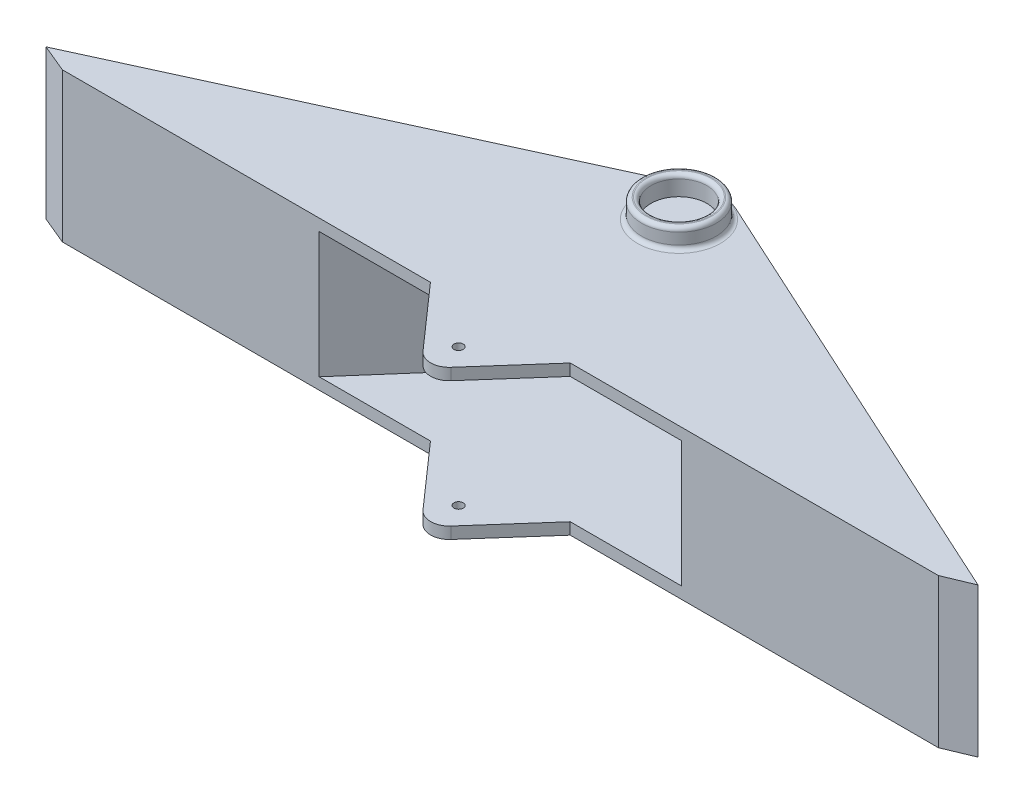
ISO-10303-21;
HEADER;
FILE_DESCRIPTION(('STEP AP214'),'2;1');
FILE_NAME('part.step','',(''),(''),'','','');
FILE_SCHEMA(('AUTOMOTIVE_DESIGN { 1 0 10303 214 1 1 1 1 }'));
ENDSEC;
DATA;
#1=APPLICATION_CONTEXT('core data for automotive mechanical design processes');
#2=APPLICATION_PROTOCOL_DEFINITION('international standard','automotive_design',2000,#1);
#3=PRODUCT_CONTEXT('',#1,'mechanical');
#4=PRODUCT('Part','Part','',(#3));
#5=PRODUCT_RELATED_PRODUCT_CATEGORY('part','',(#4));
#6=PRODUCT_DEFINITION_FORMATION('','',#4);
#7=PRODUCT_DEFINITION_CONTEXT('part definition',#1,'design');
#8=PRODUCT_DEFINITION('design','',#6,#7);
#9=PRODUCT_DEFINITION_SHAPE('','',#8);
#10=(LENGTH_UNIT() NAMED_UNIT(*) SI_UNIT(.MILLI.,.METRE.));
#11=(NAMED_UNIT(*) PLANE_ANGLE_UNIT() SI_UNIT($,.RADIAN.));
#12=(NAMED_UNIT(*) SI_UNIT($,.STERADIAN.) SOLID_ANGLE_UNIT());
#13=UNCERTAINTY_MEASURE_WITH_UNIT(LENGTH_MEASURE(1.E-05),#10,'distance_accuracy_value','');
#14=(GEOMETRIC_REPRESENTATION_CONTEXT(3) GLOBAL_UNCERTAINTY_ASSIGNED_CONTEXT((#13)) GLOBAL_UNIT_ASSIGNED_CONTEXT((#10,
#11,#12)) REPRESENTATION_CONTEXT('',''));
#15=CARTESIAN_POINT('',(0.,0.,0.));
#16=DIRECTION('',(0.,0.,1.));
#17=DIRECTION('',(1.,0.,0.));
#18=AXIS2_PLACEMENT_3D('',#15,#16,#17);
#19=CARTESIAN_POINT('',(-50.,118.756766424241,1.25));
#20=DIRECTION('',(0.,0.,-1.));
#21=DIRECTION('',(-1.,0.,0.));
#22=AXIS2_PLACEMENT_3D('',#19,#20,#21);
#23=PLANE('',#22);
#24=DIRECTION('',(0.,1.,0.));
#25=VECTOR('',#24,1.);
#26=CARTESIAN_POINT('',(-7.5,14.75,1.25));
#27=LINE('',#26,#25);
#28=CARTESIAN_POINT('',(-7.5,14.75,1.25));
#29=VERTEX_POINT('',#28);
#30=CARTESIAN_POINT('',(-7.5,16.,1.25000000000001));
#31=VERTEX_POINT('',#30);
#32=EDGE_CURVE('E56',#29,#31,#27,.T.);
#33=ORIENTED_EDGE('',*,*,#32,.T.);
#34=DIRECTION('',(1.,0.,0.));
#35=VECTOR('',#34,1.);
#36=CARTESIAN_POINT('',(50.,16.,1.25));
#37=LINE('',#36,#35);
#38=CARTESIAN_POINT('',(-47.,16.,1.25));
#39=VERTEX_POINT('',#38);
#40=EDGE_CURVE('E696',#39,#31,#37,.T.);
#41=ORIENTED_EDGE('',*,*,#40,.F.);
#42=DIRECTION('',(0.,-1.,0.));
#43=VECTOR('',#42,1.);
#44=CARTESIAN_POINT('',(-47.,118.756766424241,1.25));
#45=LINE('',#44,#43);
#46=CARTESIAN_POINT('',(-47.,0.,1.25));
#47=VERTEX_POINT('',#46);
#48=EDGE_CURVE('E710',#39,#47,#45,.T.);
#49=ORIENTED_EDGE('',*,*,#48,.T.);
#50=DIRECTION('',(-1.,0.,0.));
#51=VECTOR('',#50,1.);
#52=CARTESIAN_POINT('',(-50.,0.,1.25));
#53=LINE('',#52,#51);
#54=CARTESIAN_POINT('',(-7.5,0.,1.25));
#55=VERTEX_POINT('',#54);
#56=EDGE_CURVE('E693',#55,#47,#53,.T.);
#57=ORIENTED_EDGE('',*,*,#56,.F.);
#58=DIRECTION('',(0.,-1.,0.));
#59=VECTOR('',#58,1.);
#60=CARTESIAN_POINT('',(-7.5,1.25,1.25));
#61=LINE('',#60,#59);
#62=CARTESIAN_POINT('',(-7.5,1.25,1.25));
#63=VERTEX_POINT('',#62);
#64=EDGE_CURVE('E242',#63,#55,#61,.T.);
#65=ORIENTED_EDGE('',*,*,#64,.F.);
#66=DIRECTION('',(1.,0.,0.));
#67=VECTOR('',#66,1.);
#68=CARTESIAN_POINT('',(19.4318799434697,1.25,1.25000000000001));
#69=LINE('',#68,#67);
#70=CARTESIAN_POINT('',(-19.4318799434697,1.25,1.25));
#71=VERTEX_POINT('',#70);
#72=EDGE_CURVE('E820',#71,#63,#69,.T.);
#73=ORIENTED_EDGE('',*,*,#72,.F.);
#74=DIRECTION('',(0.,-1.,0.));
#75=VECTOR('',#74,1.);
#76=CARTESIAN_POINT('',(-19.4318799434697,118.756766424241,1.25));
#77=LINE('',#76,#75);
#78=CARTESIAN_POINT('',(-19.4318799434697,14.75,1.25));
#79=VERTEX_POINT('',#78);
#80=EDGE_CURVE('E769',#79,#71,#77,.T.);
#81=ORIENTED_EDGE('',*,*,#80,.F.);
#82=DIRECTION('',(1.,0.,0.));
#83=VECTOR('',#82,1.);
#84=CARTESIAN_POINT('',(19.4318799434697,14.75,1.25000000000001));
#85=LINE('',#84,#83);
#86=EDGE_CURVE('E814',#79,#29,#85,.T.);
#87=ORIENTED_EDGE('',*,*,#86,.T.);
#88=EDGE_LOOP('',(#33,#41,#49,#57,#65,#73,#81,#87));
#89=FACE_BOUND('',#88,.T.);
#90=ADVANCED_FACE('F33',(#89),#23,.F.);
#91=DIRECTION('',(0.,1.,0.));
#92=VECTOR('',#91,1.);
#93=CARTESIAN_POINT('',(7.5,14.75,1.25));
#94=LINE('',#93,#92);
#95=CARTESIAN_POINT('',(7.5,14.75,1.25));
#96=VERTEX_POINT('',#95);
#97=CARTESIAN_POINT('',(7.5,16.,1.25000000000001));
#98=VERTEX_POINT('',#97);
#99=EDGE_CURVE('E236',#96,#98,#94,.T.);
#100=ORIENTED_EDGE('',*,*,#99,.F.);
#101=CARTESIAN_POINT('',(19.4318799434697,14.75,1.25000000000001));
#102=VERTEX_POINT('',#101);
#103=EDGE_CURVE('E816',#96,#102,#85,.T.);
#104=ORIENTED_EDGE('',*,*,#103,.T.);
#105=DIRECTION('',(0.,-1.,0.));
#106=VECTOR('',#105,1.);
#107=CARTESIAN_POINT('',(19.4318799434697,118.756766424241,1.25000000000001));
#108=LINE('',#107,#106);
#109=CARTESIAN_POINT('',(19.4318799434697,1.25,1.25000000000001));
#110=VERTEX_POINT('',#109);
#111=EDGE_CURVE('E763',#102,#110,#108,.T.);
#112=ORIENTED_EDGE('',*,*,#111,.T.);
#113=CARTESIAN_POINT('',(7.5,1.25,1.25));
#114=VERTEX_POINT('',#113);
#115=EDGE_CURVE('E251',#114,#110,#69,.T.);
#116=ORIENTED_EDGE('',*,*,#115,.F.);
#117=DIRECTION('',(0.,-1.,0.));
#118=VECTOR('',#117,1.);
#119=CARTESIAN_POINT('',(7.5,1.25,1.25));
#120=LINE('',#119,#118);
#121=CARTESIAN_POINT('',(7.5,0.,1.25));
#122=VERTEX_POINT('',#121);
#123=EDGE_CURVE('E254',#114,#122,#120,.T.);
#124=ORIENTED_EDGE('',*,*,#123,.T.);
#125=CARTESIAN_POINT('',(46.9999999999999,0.,1.25));
#126=VERTEX_POINT('',#125);
#127=EDGE_CURVE('E702',#126,#122,#53,.T.);
#128=ORIENTED_EDGE('',*,*,#127,.F.);
#129=DIRECTION('',(0.,1.,0.));
#130=VECTOR('',#129,1.);
#131=CARTESIAN_POINT('',(46.9999999999999,118.756766424241,1.25));
#132=LINE('',#131,#130);
#133=CARTESIAN_POINT('',(47.0000000000001,16.,1.24999999999998));
#134=VERTEX_POINT('',#133);
#135=EDGE_CURVE('E715',#126,#134,#132,.T.);
#136=ORIENTED_EDGE('',*,*,#135,.T.);
#137=EDGE_CURVE('E48',#98,#134,#37,.T.);
#138=ORIENTED_EDGE('',*,*,#137,.F.);
#139=EDGE_LOOP('',(#100,#104,#112,#116,#124,#128,#136,#138));
#140=FACE_BOUND('',#139,.T.);
#141=ADVANCED_FACE('F325',(#140),#23,.F.);
#142=CARTESIAN_POINT('',(20.,118.756766424241,0.));
#143=DIRECTION('',(0.,0.,1.));
#144=DIRECTION('',(1.,0.,0.));
#145=AXIS2_PLACEMENT_3D('',#142,#143,#144);
#146=PLANE('',#145);
#147=DIRECTION('',(1.,0.,0.));
#148=VECTOR('',#147,1.);
#149=CARTESIAN_POINT('',(20.,14.75,0.));
#150=LINE('',#149,#148);
#151=CARTESIAN_POINT('',(20.,14.75,0.));
#152=VERTEX_POINT('',#151);
#153=CARTESIAN_POINT('',(50.,14.75,0.));
#154=VERTEX_POINT('',#153);
#155=EDGE_CURVE('E790',#152,#154,#150,.T.);
#156=ORIENTED_EDGE('',*,*,#155,.T.);
#157=DIRECTION('',(0.,-1.,0.));
#158=VECTOR('',#157,1.);
#159=CARTESIAN_POINT('',(50.,118.756766424241,0.));
#160=LINE('',#159,#158);
#161=CARTESIAN_POINT('',(50.,1.25,0.));
#162=VERTEX_POINT('',#161);
#163=EDGE_CURVE('E705',#154,#162,#160,.T.);
#164=ORIENTED_EDGE('',*,*,#163,.T.);
#165=DIRECTION('',(1.,0.,0.));
#166=VECTOR('',#165,1.);
#167=CARTESIAN_POINT('',(20.,1.25,0.));
#168=LINE('',#167,#166);
#169=CARTESIAN_POINT('',(20.,1.25,0.));
#170=VERTEX_POINT('',#169);
#171=EDGE_CURVE('E745',#170,#162,#168,.T.);
#172=ORIENTED_EDGE('',*,*,#171,.F.);
#173=DIRECTION('',(0.,-1.,0.));
#174=VECTOR('',#173,1.);
#175=CARTESIAN_POINT('',(20.,118.756766424241,0.));
#176=LINE('',#175,#174);
#177=EDGE_CURVE('E762',#152,#170,#176,.T.);
#178=ORIENTED_EDGE('',*,*,#177,.F.);
#179=EDGE_LOOP('',(#156,#164,#172,#178));
#180=FACE_BOUND('',#179,.T.);
#181=ADVANCED_FACE('F330',(#180),#146,.F.);
#182=CARTESIAN_POINT('',(0.753370803500888,118.756766424241,-22.0497837914261));
#183=DIRECTION('',(-0.753370803500884,0.,0.657595949221429));
#184=DIRECTION('',(0.657595949221429,0.,0.753370803500884));
#185=AXIS2_PLACEMENT_3D('',#182,#183,#184);
#186=PLANE('',#185);
#187=DIRECTION('',(0.657595949221429,0.,0.753370803500884));
#188=VECTOR('',#187,1.);
#189=CARTESIAN_POINT('',(0.753370803500888,14.75,-22.0497837914261));
#190=LINE('',#189,#188);
#191=CARTESIAN_POINT('',(0.753370803500888,14.75,-22.0497837914261));
#192=VERTEX_POINT('',#191);
#193=EDGE_CURVE('E785',#192,#152,#190,.T.);
#194=ORIENTED_EDGE('',*,*,#193,.T.);
#195=ORIENTED_EDGE('',*,*,#177,.T.);
#196=DIRECTION('',(0.657595949221429,0.,0.753370803500884));
#197=VECTOR('',#196,1.);
#198=CARTESIAN_POINT('',(0.753370803500888,1.25,-22.0497837914261));
#199=LINE('',#198,#197);
#200=CARTESIAN_POINT('',(0.753370803500888,1.25,-22.0497837914261));
#201=VERTEX_POINT('',#200);
#202=EDGE_CURVE('E748',#201,#170,#199,.T.);
#203=ORIENTED_EDGE('',*,*,#202,.F.);
#204=DIRECTION('',(0.,-1.,0.));
#205=VECTOR('',#204,1.);
#206=CARTESIAN_POINT('',(0.753370803500888,118.756766424241,-22.0497837914261));
#207=LINE('',#206,#205);
#208=EDGE_CURVE('E780',#192,#201,#207,.T.);
#209=ORIENTED_EDGE('',*,*,#208,.F.);
#210=EDGE_LOOP('',(#194,#195,#203,#209));
#211=FACE_BOUND('',#210,.T.);
#212=ADVANCED_FACE('F347',(#211),#186,.F.);
#213=CARTESIAN_POINT('',(0.,118.756766424241,-21.3921878422046));
#214=DIRECTION('',(0.,-1.,0.));
#215=DIRECTION('',(0.,0.,-1.));
#216=AXIS2_PLACEMENT_3D('',#213,#214,#215);
#217=CYLINDRICAL_SURFACE('',#216,1.);
#218=CARTESIAN_POINT('',(0.,14.75,-21.3921878422046));
#219=DIRECTION('',(0.,-1.,0.));
#220=DIRECTION('',(0.,0.,1.));
#221=AXIS2_PLACEMENT_3D('',#218,#219,#220);
#222=CIRCLE('',#221,1.);
#223=CARTESIAN_POINT('',(-0.753370803500882,14.75,-22.0497837914261));
#224=VERTEX_POINT('',#223);
#225=EDGE_CURVE('E799',#224,#192,#222,.T.);
#226=ORIENTED_EDGE('',*,*,#225,.T.);
#227=ORIENTED_EDGE('',*,*,#208,.T.);
#228=CARTESIAN_POINT('',(0.,1.25,-21.3921878422046));
#229=DIRECTION('',(0.,-1.,0.));
#230=DIRECTION('',(0.,0.,1.));
#231=AXIS2_PLACEMENT_3D('',#228,#229,#230);
#232=CIRCLE('',#231,1.);
#233=CARTESIAN_POINT('',(-0.753370803500882,1.25,-22.0497837914261));
#234=VERTEX_POINT('',#233);
#235=EDGE_CURVE('E751',#234,#201,#232,.T.);
#236=ORIENTED_EDGE('',*,*,#235,.F.);
#237=DIRECTION('',(0.,-1.,0.));
#238=VECTOR('',#237,1.);
#239=CARTESIAN_POINT('',(-0.753370803500882,118.756766424241,-22.0497837914261));
#240=LINE('',#239,#238);
#241=EDGE_CURVE('E778',#224,#234,#240,.T.);
#242=ORIENTED_EDGE('',*,*,#241,.F.);
#243=EDGE_LOOP('',(#226,#227,#236,#242));
#244=FACE_BOUND('',#243,.T.);
#245=ADVANCED_FACE('F343',(#244),#217,.T.);
#246=CARTESIAN_POINT('',(-20.,118.756766424241,0.));
#247=DIRECTION('',(0.753370803500884,0.,0.65759594922143));
#248=DIRECTION('',(0.65759594922143,0.,-0.753370803500884));
#249=AXIS2_PLACEMENT_3D('',#246,#247,#248);
#250=PLANE('',#249);
#251=DIRECTION('',(0.65759594922143,0.,-0.753370803500884));
#252=VECTOR('',#251,1.);
#253=CARTESIAN_POINT('',(-0.753370803500882,14.75,-22.0497837914261));
#254=LINE('',#253,#252);
#255=CARTESIAN_POINT('',(-20.,14.75,0.));
#256=VERTEX_POINT('',#255);
#257=EDGE_CURVE('E802',#256,#224,#254,.T.);
#258=ORIENTED_EDGE('',*,*,#257,.T.);
#259=ORIENTED_EDGE('',*,*,#241,.T.);
#260=DIRECTION('',(0.65759594922143,0.,-0.753370803500884));
#261=VECTOR('',#260,1.);
#262=CARTESIAN_POINT('',(-0.753370803500882,1.25,-22.0497837914261));
#263=LINE('',#262,#261);
#264=CARTESIAN_POINT('',(-20.,1.25,0.));
#265=VERTEX_POINT('',#264);
#266=EDGE_CURVE('E754',#265,#234,#263,.T.);
#267=ORIENTED_EDGE('',*,*,#266,.F.);
#268=DIRECTION('',(0.,-1.,0.));
#269=VECTOR('',#268,1.);
#270=CARTESIAN_POINT('',(-20.,118.756766424241,0.));
#271=LINE('',#270,#269);
#272=EDGE_CURVE('E776',#256,#265,#271,.T.);
#273=ORIENTED_EDGE('',*,*,#272,.F.);
#274=EDGE_LOOP('',(#258,#259,#267,#273));
#275=FACE_BOUND('',#274,.T.);
#276=ADVANCED_FACE('F339',(#275),#250,.F.);
#277=CARTESIAN_POINT('',(-50.,118.756766424241,0.));
#278=DIRECTION('',(0.,0.,1.));
#279=DIRECTION('',(1.,0.,0.));
#280=AXIS2_PLACEMENT_3D('',#277,#278,#279);
#281=PLANE('',#280);
#282=DIRECTION('',(1.,0.,0.));
#283=VECTOR('',#282,1.);
#284=CARTESIAN_POINT('',(-20.,14.75,0.));
#285=LINE('',#284,#283);
#286=CARTESIAN_POINT('',(-50.,14.75,0.));
#287=VERTEX_POINT('',#286);
#288=EDGE_CURVE('E684',#287,#256,#285,.T.);
#289=ORIENTED_EDGE('',*,*,#288,.T.);
#290=ORIENTED_EDGE('',*,*,#272,.T.);
#291=DIRECTION('',(1.,0.,0.));
#292=VECTOR('',#291,1.);
#293=CARTESIAN_POINT('',(-20.,1.25,0.));
#294=LINE('',#293,#292);
#295=CARTESIAN_POINT('',(-50.,1.25,0.));
#296=VERTEX_POINT('',#295);
#297=EDGE_CURVE('E735',#296,#265,#294,.T.);
#298=ORIENTED_EDGE('',*,*,#297,.F.);
#299=DIRECTION('',(0.,-1.,0.));
#300=VECTOR('',#299,1.);
#301=CARTESIAN_POINT('',(-50.,118.756766424241,0.));
#302=LINE('',#301,#300);
#303=EDGE_CURVE('E775',#287,#296,#302,.T.);
#304=ORIENTED_EDGE('',*,*,#303,.F.);
#305=EDGE_LOOP('',(#289,#290,#298,#304));
#306=FACE_BOUND('',#305,.T.);
#307=ADVANCED_FACE('F335',(#306),#281,.F.);
#308=CARTESIAN_POINT('',(50.,1.25,0.));
#309=DIRECTION('',(-0.416597790450531,0.,0.909090909090909));
#310=DIRECTION('',(0.909090909090909,0.,0.416597790450531));
#311=AXIS2_PLACEMENT_3D('',#308,#309,#310);
#312=PLANE('',#311);
#313=DIRECTION('',(-0.909090909090909,0.,-0.416597790450531));
#314=VECTOR('',#313,1.);
#315=CARTESIAN_POINT('',(50.,0.,0.));
#316=LINE('',#315,#314);
#317=CARTESIAN_POINT('',(50.,0.,0.));
#318=VERTEX_POINT('',#317);
#319=CARTESIAN_POINT('',(2.08298895225268,0.,-21.9583330202337));
#320=VERTEX_POINT('',#319);
#321=EDGE_CURVE('E738',#318,#320,#316,.T.);
#322=ORIENTED_EDGE('',*,*,#321,.T.);
#323=DIRECTION('',(0.,-1.,0.));
#324=VECTOR('',#323,1.);
#325=CARTESIAN_POINT('',(2.08298895225268,1.25,-21.9583330202337));
#326=LINE('',#325,#324);
#327=CARTESIAN_POINT('',(2.08298895225268,1.25,-21.9583330202337));
#328=VERTEX_POINT('',#327);
#329=EDGE_CURVE('E722',#328,#320,#326,.T.);
#330=ORIENTED_EDGE('',*,*,#329,.F.);
#331=DIRECTION('',(-0.909090909090909,0.,-0.416597790450531));
#332=VECTOR('',#331,1.);
#333=CARTESIAN_POINT('',(50.,1.25,0.));
#334=LINE('',#333,#332);
#335=EDGE_CURVE('E743',#162,#328,#334,.T.);
#336=ORIENTED_EDGE('',*,*,#335,.F.);
#337=DIRECTION('',(0.,-1.,0.));
#338=VECTOR('',#337,1.);
#339=CARTESIAN_POINT('',(50.,1.25,0.));
#340=LINE('',#339,#338);
#341=EDGE_CURVE('E720',#162,#318,#340,.T.);
#342=ORIENTED_EDGE('',*,*,#341,.T.);
#343=EDGE_LOOP('',(#322,#330,#336,#342));
#344=FACE_BOUND('',#343,.T.);
#345=ADVANCED_FACE('F338',(#344),#312,.F.);
#346=CARTESIAN_POINT('',(0.,1.25,-17.4128784747792));
#347=DIRECTION('',(0.,-1.,0.));
#348=DIRECTION('',(0.,0.,-1.));
#349=AXIS2_PLACEMENT_3D('',#346,#347,#348);
#350=CYLINDRICAL_SURFACE('',#349,5.);
#351=CARTESIAN_POINT('',(0.,0.,-17.4128784747792));
#352=DIRECTION('',(0.,1.,0.));
#353=DIRECTION('',(0.,0.,1.));
#354=AXIS2_PLACEMENT_3D('',#351,#352,#353);
#355=CIRCLE('',#354,5.);
#356=CARTESIAN_POINT('',(-2.08298895225267,0.,-21.9583330202337));
#357=VERTEX_POINT('',#356);
#358=EDGE_CURVE('E736',#320,#357,#355,.T.);
#359=ORIENTED_EDGE('',*,*,#358,.T.);
#360=DIRECTION('',(0.,-1.,0.));
#361=VECTOR('',#360,1.);
#362=CARTESIAN_POINT('',(-2.08298895225267,1.25,-21.9583330202337));
#363=LINE('',#362,#361);
#364=CARTESIAN_POINT('',(-2.08298895225267,1.25,-21.9583330202337));
#365=VERTEX_POINT('',#364);
#366=EDGE_CURVE('E725',#365,#357,#363,.T.);
#367=ORIENTED_EDGE('',*,*,#366,.F.);
#368=CARTESIAN_POINT('',(0.,1.25,-17.4128784747792));
#369=DIRECTION('',(0.,1.,0.));
#370=DIRECTION('',(0.,0.,1.));
#371=AXIS2_PLACEMENT_3D('',#368,#369,#370);
#372=CIRCLE('',#371,5.);
#373=EDGE_CURVE('E741',#328,#365,#372,.T.);
#374=ORIENTED_EDGE('',*,*,#373,.F.);
#375=ORIENTED_EDGE('',*,*,#329,.T.);
#376=EDGE_LOOP('',(#359,#367,#374,#375));
#377=FACE_BOUND('',#376,.T.);
#378=ADVANCED_FACE('F373',(#377),#350,.T.);
#379=CARTESIAN_POINT('',(-50.,1.25,0.));
#380=DIRECTION('',(0.416597790450531,0.,0.909090909090909));
#381=DIRECTION('',(0.909090909090909,0.,-0.416597790450531));
#382=AXIS2_PLACEMENT_3D('',#379,#380,#381);
#383=PLANE('',#382);
#384=DIRECTION('',(-0.909090909090909,0.,0.416597790450531));
#385=VECTOR('',#384,1.);
#386=CARTESIAN_POINT('',(-50.,0.,0.));
#387=LINE('',#386,#385);
#388=CARTESIAN_POINT('',(-50.,0.,0.));
#389=VERTEX_POINT('',#388);
#390=EDGE_CURVE('E732',#357,#389,#387,.T.);
#391=ORIENTED_EDGE('',*,*,#390,.T.);
#392=DIRECTION('',(0.,-1.,0.));
#393=VECTOR('',#392,1.);
#394=CARTESIAN_POINT('',(-50.,1.25,0.));
#395=LINE('',#394,#393);
#396=EDGE_CURVE('E728',#296,#389,#395,.T.);
#397=ORIENTED_EDGE('',*,*,#396,.F.);
#398=DIRECTION('',(-0.909090909090909,0.,0.416597790450531));
#399=VECTOR('',#398,1.);
#400=CARTESIAN_POINT('',(-50.,1.25,0.));
#401=LINE('',#400,#399);
#402=EDGE_CURVE('E731',#365,#296,#401,.T.);
#403=ORIENTED_EDGE('',*,*,#402,.F.);
#404=ORIENTED_EDGE('',*,*,#366,.T.);
#405=EDGE_LOOP('',(#391,#397,#403,#404));
#406=FACE_BOUND('',#405,.T.);
#407=ADVANCED_FACE('F366',(#406),#383,.F.);
#408=CARTESIAN_POINT('',(0.,1.25,-17.4128784747792));
#409=DIRECTION('',(0.,1.,0.));
#410=DIRECTION('',(0.,0.,1.));
#411=AXIS2_PLACEMENT_3D('',#408,#409,#410);
#412=PLANE('',#411);
#413=ORIENTED_EDGE('',*,*,#297,.T.);
#414=ORIENTED_EDGE('',*,*,#266,.T.);
#415=ORIENTED_EDGE('',*,*,#235,.T.);
#416=ORIENTED_EDGE('',*,*,#202,.T.);
#417=ORIENTED_EDGE('',*,*,#171,.T.);
#418=ORIENTED_EDGE('',*,*,#335,.T.);
#419=ORIENTED_EDGE('',*,*,#373,.T.);
#420=ORIENTED_EDGE('',*,*,#402,.T.);
#421=EDGE_LOOP('',(#413,#414,#415,#416,#417,#418,#419,#420));
#422=FACE_BOUND('',#421,.T.);
#423=ADVANCED_FACE('F362',(#422),#412,.T.);
#424=CARTESIAN_POINT('',(0.,0.,-17.4128784747792));
#425=DIRECTION('',(0.,1.,0.));
#426=DIRECTION('',(0.,0.,1.));
#427=AXIS2_PLACEMENT_3D('',#424,#425,#426);
#428=PLANE('',#427);
#429=CARTESIAN_POINT('',(0.,0.,5.72712425366543));
#430=DIRECTION('',(0.,-1.,0.));
#431=DIRECTION('',(0.,0.,-1.));
#432=AXIS2_PLACEMENT_3D('',#429,#430,#431);
#433=CIRCLE('',#432,0.5);
#434=CARTESIAN_POINT('',(0.,0.,5.22712425366543));
#435=VERTEX_POINT('',#434);
#436=EDGE_CURVE('E900',#435,#435,#433,.T.);
#437=ORIENTED_EDGE('',*,*,#436,.F.);
#438=EDGE_LOOP('',(#437));
#439=FACE_BOUND('',#438,.T.);
#440=DIRECTION('',(0.923076923076924,0.,-0.384615384615382));
#441=VECTOR('',#440,1.);
#442=CARTESIAN_POINT('',(50.,0.,0.));
#443=LINE('',#442,#441);
#444=EDGE_CURVE('E717',#318,#126,#443,.F.);
#445=ORIENTED_EDGE('',*,*,#444,.T.);
#446=ORIENTED_EDGE('',*,*,#127,.T.);
#447=DIRECTION('',(-0.661621637086846,0.,0.749837855365092));
#448=VECTOR('',#447,1.);
#449=CARTESIAN_POINT('',(7.5,0.,1.25));
#450=LINE('',#449,#448);
#451=CARTESIAN_POINT('',(1.4996757107302,0.,8.05036752783912));
#452=VERTEX_POINT('',#451);
#453=EDGE_CURVE('E248',#122,#452,#450,.T.);
#454=ORIENTED_EDGE('',*,*,#453,.T.);
#455=CARTESIAN_POINT('',(0.,0.,6.72712425366543));
#456=DIRECTION('',(0.,-1.,0.));
#457=DIRECTION('',(0.,0.,-1.));
#458=AXIS2_PLACEMENT_3D('',#455,#456,#457);
#459=CIRCLE('',#458,2.);
#460=CARTESIAN_POINT('',(-1.4996757107302,0.,8.05036752783911));
#461=VERTEX_POINT('',#460);
#462=EDGE_CURVE('E244',#452,#461,#459,.T.);
#463=ORIENTED_EDGE('',*,*,#462,.T.);
#464=DIRECTION('',(-0.661621637086846,0.,-0.749837855365093));
#465=VECTOR('',#464,1.);
#466=CARTESIAN_POINT('',(-1.4996757107302,0.,8.05036752783911));
#467=LINE('',#466,#465);
#468=EDGE_CURVE('E235',#461,#55,#467,.T.);
#469=ORIENTED_EDGE('',*,*,#468,.T.);
#470=ORIENTED_EDGE('',*,*,#56,.T.);
#471=DIRECTION('',(0.923076923076924,0.,0.384615384615383));
#472=VECTOR('',#471,1.);
#473=CARTESIAN_POINT('',(-47.,0.,1.25));
#474=LINE('',#473,#472);
#475=EDGE_CURVE('E708',#47,#389,#474,.F.);
#476=ORIENTED_EDGE('',*,*,#475,.T.);
#477=ORIENTED_EDGE('',*,*,#390,.F.);
#478=ORIENTED_EDGE('',*,*,#358,.F.);
#479=ORIENTED_EDGE('',*,*,#321,.F.);
#480=EDGE_LOOP('',(#445,#446,#454,#463,#469,#470,#476,#477,#478,#479));
#481=FACE_BOUND('',#480,.T.);
#482=ADVANCED_FACE('F365',(#439,#481),#428,.F.);
#483=CARTESIAN_POINT('',(-19.4318799434697,118.756766424241,1.25));
#484=DIRECTION('',(-0.753370803500884,0.,-0.657595949221429));
#485=DIRECTION('',(-0.65759594922143,0.,0.753370803500884));
#486=AXIS2_PLACEMENT_3D('',#483,#484,#485);
#487=PLANE('',#486);
#488=ORIENTED_EDGE('',*,*,#80,.T.);
#489=DIRECTION('',(-0.657595949221429,0.,0.753370803500883));
#490=VECTOR('',#489,1.);
#491=CARTESIAN_POINT('',(-19.4318799434697,1.25,1.25));
#492=LINE('',#491,#490);
#493=CARTESIAN_POINT('',(0.,1.25,-21.012015184061));
#494=VERTEX_POINT('',#493);
#495=EDGE_CURVE('E819',#494,#71,#492,.T.);
#496=ORIENTED_EDGE('',*,*,#495,.F.);
#497=DIRECTION('',(0.,-1.,0.));
#498=VECTOR('',#497,1.);
#499=CARTESIAN_POINT('',(0.,118.756766424241,-21.012015184061));
#500=LINE('',#499,#498);
#501=CARTESIAN_POINT('',(0.,14.75,-21.012015184061));
#502=VERTEX_POINT('',#501);
#503=EDGE_CURVE('E766',#502,#494,#500,.T.);
#504=ORIENTED_EDGE('',*,*,#503,.F.);
#505=DIRECTION('',(-0.657595949221429,0.,0.753370803500883));
#506=VECTOR('',#505,1.);
#507=CARTESIAN_POINT('',(-19.4318799434697,14.75,1.25));
#508=LINE('',#507,#506);
#509=EDGE_CURVE('E806',#502,#79,#508,.T.);
#510=ORIENTED_EDGE('',*,*,#509,.T.);
#511=EDGE_LOOP('',(#488,#496,#504,#510));
#512=FACE_BOUND('',#511,.T.);
#513=ADVANCED_FACE('F333',(#512),#487,.F.);
#514=CARTESIAN_POINT('',(19.4318799434697,118.756766424241,1.25000000000001));
#515=DIRECTION('',(0.753370803500883,0.,-0.65759594922143));
#516=DIRECTION('',(-0.65759594922143,0.,-0.753370803500883));
#517=AXIS2_PLACEMENT_3D('',#514,#515,#516);
#518=PLANE('',#517);
#519=ORIENTED_EDGE('',*,*,#503,.T.);
#520=DIRECTION('',(-0.65759594922143,0.,-0.753370803500883));
#521=VECTOR('',#520,1.);
#522=CARTESIAN_POINT('',(0.,1.25,-21.012015184061));
#523=LINE('',#522,#521);
#524=EDGE_CURVE('E817',#110,#494,#523,.T.);
#525=ORIENTED_EDGE('',*,*,#524,.F.);
#526=ORIENTED_EDGE('',*,*,#111,.F.);
#527=DIRECTION('',(-0.65759594922143,0.,-0.753370803500883));
#528=VECTOR('',#527,1.);
#529=CARTESIAN_POINT('',(0.,14.75,-21.012015184061));
#530=LINE('',#529,#528);
#531=EDGE_CURVE('E811',#102,#502,#530,.T.);
#532=ORIENTED_EDGE('',*,*,#531,.T.);
#533=EDGE_LOOP('',(#519,#525,#526,#532));
#534=FACE_BOUND('',#533,.T.);
#535=ADVANCED_FACE('F359',(#534),#518,.F.);
#536=CARTESIAN_POINT('',(0.,16.,-17.4128784747792));
#537=DIRECTION('',(0.,1.,0.));
#538=DIRECTION('',(0.,0.,1.));
#539=AXIS2_PLACEMENT_3D('',#536,#537,#538);
#540=PLANE('',#539);
#541=CARTESIAN_POINT('',(0.,16.,-17.9128784747792));
#542=DIRECTION('',(0.,1.,0.));
#543=DIRECTION('',(0.,0.,1.));
#544=AXIS2_PLACEMENT_3D('',#541,#542,#543);
#545=CIRCLE('',#544,4.45);
#546=CARTESIAN_POINT('',(0.,16.,-13.4628784747792));
#547=VERTEX_POINT('',#546);
#548=EDGE_CURVE('E11',#547,#547,#545,.F.);
#549=ORIENTED_EDGE('',*,*,#548,.T.);
#550=EDGE_LOOP('',(#549));
#551=FACE_BOUND('',#550,.T.);
#552=CARTESIAN_POINT('',(0.,16.,5.72712425366543));
#553=DIRECTION('',(0.,1.,0.));
#554=DIRECTION('',(0.,0.,1.));
#555=AXIS2_PLACEMENT_3D('',#552,#553,#554);
#556=CIRCLE('',#555,0.5);
#557=CARTESIAN_POINT('',(0.,16.,6.22712425366543));
#558=VERTEX_POINT('',#557);
#559=EDGE_CURVE('E280',#558,#558,#556,.F.);
#560=ORIENTED_EDGE('',*,*,#559,.T.);
#561=EDGE_LOOP('',(#560));
#562=FACE_BOUND('',#561,.T.);
#563=DIRECTION('',(-0.909090909090909,0.,0.416597790450531));
#564=VECTOR('',#563,1.);
#565=CARTESIAN_POINT('',(-50.,16.,0.));
#566=LINE('',#565,#564);
#567=CARTESIAN_POINT('',(-2.08298895225267,16.,-21.9583330202337));
#568=VERTEX_POINT('',#567);
#569=CARTESIAN_POINT('',(-50.,16.,0.));
#570=VERTEX_POINT('',#569);
#571=EDGE_CURVE('E681',#568,#570,#566,.T.);
#572=ORIENTED_EDGE('',*,*,#571,.T.);
#573=DIRECTION('',(-0.923076923076924,0.,-0.384615384615383));
#574=VECTOR('',#573,1.);
#575=CARTESIAN_POINT('',(-13.5785367366079,16.,15.17560969308));
#576=LINE('',#575,#574);
#577=EDGE_CURVE('E285',#570,#39,#576,.F.);
#578=ORIENTED_EDGE('',*,*,#577,.T.);
#579=ORIENTED_EDGE('',*,*,#40,.T.);
#580=DIRECTION('',(-0.661621637086846,0.,-0.749837855365093));
#581=VECTOR('',#580,1.);
#582=CARTESIAN_POINT('',(-1.4996757107302,16.,8.05036752783911));
#583=LINE('',#582,#581);
#584=CARTESIAN_POINT('',(-1.4996757107302,16.,8.05036752783911));
#585=VERTEX_POINT('',#584);
#586=EDGE_CURVE('E231',#585,#31,#583,.T.);
#587=ORIENTED_EDGE('',*,*,#586,.F.);
#588=CARTESIAN_POINT('',(0.,16.,6.72712425366543));
#589=DIRECTION('',(0.,-1.,0.));
#590=DIRECTION('',(0.,0.,-1.));
#591=AXIS2_PLACEMENT_3D('',#588,#589,#590);
#592=CIRCLE('',#591,2.);
#593=CARTESIAN_POINT('',(1.4996757107302,16.,8.05036752783912));
#594=VERTEX_POINT('',#593);
#595=EDGE_CURVE('E216',#594,#585,#592,.T.);
#596=ORIENTED_EDGE('',*,*,#595,.F.);
#597=DIRECTION('',(-0.661621637086846,0.,0.749837855365092));
#598=VECTOR('',#597,1.);
#599=CARTESIAN_POINT('',(7.5,16.,1.25));
#600=LINE('',#599,#598);
#601=EDGE_CURVE('E223',#98,#594,#600,.T.);
#602=ORIENTED_EDGE('',*,*,#601,.F.);
#603=ORIENTED_EDGE('',*,*,#137,.T.);
#604=DIRECTION('',(-0.923076923076924,0.,0.384615384615382));
#605=VECTOR('',#604,1.);
#606=CARTESIAN_POINT('',(13.5785367366079,16.,15.1756096930799));
#607=LINE('',#606,#605);
#608=CARTESIAN_POINT('',(50.,16.,0.));
#609=VERTEX_POINT('',#608);
#610=EDGE_CURVE('E713',#134,#609,#607,.F.);
#611=ORIENTED_EDGE('',*,*,#610,.T.);
#612=DIRECTION('',(-0.909090909090909,0.,-0.416597790450531));
#613=VECTOR('',#612,1.);
#614=CARTESIAN_POINT('',(50.,16.,0.));
#615=LINE('',#614,#613);
#616=CARTESIAN_POINT('',(2.08298895225268,16.,-21.9583330202337));
#617=VERTEX_POINT('',#616);
#618=EDGE_CURVE('E686',#609,#617,#615,.T.);
#619=ORIENTED_EDGE('',*,*,#618,.T.);
#620=CARTESIAN_POINT('',(0.,16.,-17.4128784747792));
#621=DIRECTION('',(0.,1.,0.));
#622=DIRECTION('',(0.,0.,1.));
#623=AXIS2_PLACEMENT_3D('',#620,#621,#622);
#624=CIRCLE('',#623,5.);
#625=EDGE_CURVE('E688',#617,#568,#624,.T.);
#626=ORIENTED_EDGE('',*,*,#625,.T.);
#627=EDGE_LOOP('',(#572,#578,#579,#587,#596,#602,#603,#611,#619,#626));
#628=FACE_BOUND('',#627,.T.);
#629=ADVANCED_FACE('F355',(#551,#562,#628),#540,.T.);
#630=CARTESIAN_POINT('',(50.,16.,0.));
#631=DIRECTION('',(-0.416597790450531,0.,0.909090909090909));
#632=DIRECTION('',(0.909090909090909,0.,0.416597790450531));
#633=AXIS2_PLACEMENT_3D('',#630,#631,#632);
#634=PLANE('',#633);
#635=DIRECTION('',(-0.909090909090909,0.,-0.416597790450531));
#636=VECTOR('',#635,1.);
#637=CARTESIAN_POINT('',(50.,14.75,0.));
#638=LINE('',#637,#636);
#639=CARTESIAN_POINT('',(2.08298895225268,14.75,-21.9583330202337));
#640=VERTEX_POINT('',#639);
#641=EDGE_CURVE('E677',#154,#640,#638,.T.);
#642=ORIENTED_EDGE('',*,*,#641,.T.);
#643=DIRECTION('',(0.,-1.,0.));
#644=VECTOR('',#643,1.);
#645=CARTESIAN_POINT('',(2.08298895225268,16.,-21.9583330202337));
#646=LINE('',#645,#644);
#647=EDGE_CURVE('E673',#617,#640,#646,.T.);
#648=ORIENTED_EDGE('',*,*,#647,.F.);
#649=ORIENTED_EDGE('',*,*,#618,.F.);
#650=EDGE_CURVE('E759',#609,#154,#160,.T.);
#651=ORIENTED_EDGE('',*,*,#650,.T.);
#652=EDGE_LOOP('',(#642,#648,#649,#651));
#653=FACE_BOUND('',#652,.T.);
#654=ADVANCED_FACE('F358',(#653),#634,.F.);
#655=CARTESIAN_POINT('',(0.,16.,-17.4128784747792));
#656=DIRECTION('',(0.,-1.,0.));
#657=DIRECTION('',(0.,0.,-1.));
#658=AXIS2_PLACEMENT_3D('',#655,#656,#657);
#659=CYLINDRICAL_SURFACE('',#658,5.);
#660=CARTESIAN_POINT('',(0.,14.75,-17.4128784747792));
#661=DIRECTION('',(0.,1.,0.));
#662=DIRECTION('',(0.,0.,1.));
#663=AXIS2_PLACEMENT_3D('',#660,#661,#662);
#664=CIRCLE('',#663,5.);
#665=CARTESIAN_POINT('',(-2.08298895225267,14.75,-21.9583330202337));
#666=VERTEX_POINT('',#665);
#667=EDGE_CURVE('E667',#640,#666,#664,.T.);
#668=ORIENTED_EDGE('',*,*,#667,.T.);
#669=DIRECTION('',(0.,-1.,0.));
#670=VECTOR('',#669,1.);
#671=CARTESIAN_POINT('',(-2.08298895225267,16.,-21.9583330202337));
#672=LINE('',#671,#670);
#673=EDGE_CURVE('E670',#568,#666,#672,.T.);
#674=ORIENTED_EDGE('',*,*,#673,.F.);
#675=ORIENTED_EDGE('',*,*,#625,.F.);
#676=ORIENTED_EDGE('',*,*,#647,.T.);
#677=EDGE_LOOP('',(#668,#674,#675,#676));
#678=FACE_BOUND('',#677,.T.);
#679=ADVANCED_FACE('F582',(#678),#659,.T.);
#680=CARTESIAN_POINT('',(-50.,16.,0.));
#681=DIRECTION('',(0.416597790450531,0.,0.909090909090909));
#682=DIRECTION('',(0.909090909090909,0.,-0.416597790450531));
#683=AXIS2_PLACEMENT_3D('',#680,#681,#682);
#684=PLANE('',#683);
#685=DIRECTION('',(-0.909090909090909,0.,0.416597790450531));
#686=VECTOR('',#685,1.);
#687=CARTESIAN_POINT('',(-50.,14.75,0.));
#688=LINE('',#687,#686);
#689=EDGE_CURVE('E676',#666,#287,#688,.T.);
#690=ORIENTED_EDGE('',*,*,#689,.T.);
#691=EDGE_CURVE('E772',#570,#287,#302,.T.);
#692=ORIENTED_EDGE('',*,*,#691,.F.);
#693=ORIENTED_EDGE('',*,*,#571,.F.);
#694=ORIENTED_EDGE('',*,*,#673,.T.);
#695=EDGE_LOOP('',(#690,#692,#693,#694));
#696=FACE_BOUND('',#695,.T.);
#697=ADVANCED_FACE('F571',(#696),#684,.F.);
#698=CARTESIAN_POINT('',(0.,14.75,-17.4128784747792));
#699=DIRECTION('',(0.,1.,0.));
#700=DIRECTION('',(0.,0.,1.));
#701=AXIS2_PLACEMENT_3D('',#698,#699,#700);
#702=PLANE('',#701);
#703=ORIENTED_EDGE('',*,*,#288,.F.);
#704=ORIENTED_EDGE('',*,*,#689,.F.);
#705=ORIENTED_EDGE('',*,*,#667,.F.);
#706=ORIENTED_EDGE('',*,*,#641,.F.);
#707=ORIENTED_EDGE('',*,*,#155,.F.);
#708=ORIENTED_EDGE('',*,*,#193,.F.);
#709=ORIENTED_EDGE('',*,*,#225,.F.);
#710=ORIENTED_EDGE('',*,*,#257,.F.);
#711=EDGE_LOOP('',(#703,#704,#705,#706,#707,#708,#709,#710));
#712=FACE_BOUND('',#711,.T.);
#713=ADVANCED_FACE('F385',(#712),#702,.F.);
#714=CARTESIAN_POINT('',(50.,118.756766424241,0.));
#715=DIRECTION('',(-0.384615384615382,0.,-0.923076923076924));
#716=DIRECTION('',(0.,-1.,0.));
#717=AXIS2_PLACEMENT_3D('',#714,#715,#716);
#718=PLANE('',#717);
#719=ORIENTED_EDGE('',*,*,#610,.F.);
#720=ORIENTED_EDGE('',*,*,#135,.F.);
#721=ORIENTED_EDGE('',*,*,#444,.F.);
#722=ORIENTED_EDGE('',*,*,#341,.F.);
#723=ORIENTED_EDGE('',*,*,#163,.F.);
#724=ORIENTED_EDGE('',*,*,#650,.F.);
#725=EDGE_LOOP('',(#719,#720,#721,#722,#723,#724));
#726=FACE_BOUND('',#725,.T.);
#727=ADVANCED_FACE('F381',(#726),#718,.F.);
#728=CARTESIAN_POINT('',(-47.,118.756766424241,1.25));
#729=DIRECTION('',(0.384615384615383,0.,-0.923076923076924));
#730=DIRECTION('',(0.,-1.,0.));
#731=AXIS2_PLACEMENT_3D('',#728,#729,#730);
#732=PLANE('',#731);
#733=ORIENTED_EDGE('',*,*,#303,.T.);
#734=ORIENTED_EDGE('',*,*,#396,.T.);
#735=ORIENTED_EDGE('',*,*,#475,.F.);
#736=ORIENTED_EDGE('',*,*,#48,.F.);
#737=ORIENTED_EDGE('',*,*,#577,.F.);
#738=ORIENTED_EDGE('',*,*,#691,.T.);
#739=EDGE_LOOP('',(#733,#734,#735,#736,#737,#738));
#740=FACE_BOUND('',#739,.T.);
#741=ADVANCED_FACE('F384',(#740),#732,.F.);
#742=CARTESIAN_POINT('',(0.,14.75,0.));
#743=DIRECTION('',(0.,-1.,0.));
#744=DIRECTION('',(0.,0.,-1.));
#745=AXIS2_PLACEMENT_3D('',#742,#743,#744);
#746=PLANE('',#745);
#747=CARTESIAN_POINT('',(0.,14.75,5.72712425366543));
#748=DIRECTION('',(0.,-1.,0.));
#749=DIRECTION('',(0.,0.,-1.));
#750=AXIS2_PLACEMENT_3D('',#747,#748,#749);
#751=CIRCLE('',#750,0.5);
#752=CARTESIAN_POINT('',(0.,14.75,5.22712425366543));
#753=VERTEX_POINT('',#752);
#754=EDGE_CURVE('E227',#753,#753,#751,.T.);
#755=ORIENTED_EDGE('',*,*,#754,.F.);
#756=EDGE_LOOP('',(#755));
#757=FACE_BOUND('',#756,.T.);
#758=ORIENTED_EDGE('',*,*,#86,.F.);
#759=ORIENTED_EDGE('',*,*,#509,.F.);
#760=ORIENTED_EDGE('',*,*,#531,.F.);
#761=ORIENTED_EDGE('',*,*,#103,.F.);
#762=DIRECTION('',(-0.661621637086846,0.,0.749837855365092));
#763=VECTOR('',#762,1.);
#764=CARTESIAN_POINT('',(7.5,14.75,1.25));
#765=LINE('',#764,#763);
#766=CARTESIAN_POINT('',(1.4996757107302,14.75,8.05036752783912));
#767=VERTEX_POINT('',#766);
#768=EDGE_CURVE('E207',#96,#767,#765,.T.);
#769=ORIENTED_EDGE('',*,*,#768,.T.);
#770=CARTESIAN_POINT('',(0.,14.75,6.72712425366543));
#771=DIRECTION('',(0.,-1.,0.));
#772=DIRECTION('',(0.,0.,-1.));
#773=AXIS2_PLACEMENT_3D('',#770,#771,#772);
#774=CIRCLE('',#773,2.);
#775=CARTESIAN_POINT('',(-1.4996757107302,14.75,8.05036752783911));
#776=VERTEX_POINT('',#775);
#777=EDGE_CURVE('E201',#767,#776,#774,.T.);
#778=ORIENTED_EDGE('',*,*,#777,.T.);
#779=DIRECTION('',(-0.661621637086846,0.,-0.749837855365093));
#780=VECTOR('',#779,1.);
#781=CARTESIAN_POINT('',(-1.4996757107302,14.75,8.05036752783911));
#782=LINE('',#781,#780);
#783=EDGE_CURVE('E205',#776,#29,#782,.T.);
#784=ORIENTED_EDGE('',*,*,#783,.T.);
#785=EDGE_LOOP('',(#758,#759,#760,#761,#769,#778,#784));
#786=FACE_BOUND('',#785,.T.);
#787=ADVANCED_FACE('F203',(#757,#786),#746,.T.);
#788=CARTESIAN_POINT('',(0.,1.25,0.));
#789=DIRECTION('',(0.,1.,0.));
#790=DIRECTION('',(0.,0.,-1.));
#791=AXIS2_PLACEMENT_3D('',#788,#789,#790);
#792=PLANE('',#791);
#793=CARTESIAN_POINT('',(0.,1.25,5.72712425366543));
#794=DIRECTION('',(0.,1.,0.));
#795=DIRECTION('',(0.,0.,1.));
#796=AXIS2_PLACEMENT_3D('',#793,#794,#795);
#797=CIRCLE('',#796,0.5);
#798=CARTESIAN_POINT('',(0.,1.25,6.22712425366543));
#799=VERTEX_POINT('',#798);
#800=EDGE_CURVE('E277',#799,#799,#797,.T.);
#801=ORIENTED_EDGE('',*,*,#800,.F.);
#802=EDGE_LOOP('',(#801));
#803=FACE_BOUND('',#802,.T.);
#804=ORIENTED_EDGE('',*,*,#72,.T.);
#805=DIRECTION('',(-0.661621637086846,0.,-0.749837855365093));
#806=VECTOR('',#805,1.);
#807=CARTESIAN_POINT('',(-1.4996757107302,1.25,8.05036752783911));
#808=LINE('',#807,#806);
#809=CARTESIAN_POINT('',(-1.4996757107302,1.25,8.05036752783911));
#810=VERTEX_POINT('',#809);
#811=EDGE_CURVE('E247',#810,#63,#808,.T.);
#812=ORIENTED_EDGE('',*,*,#811,.F.);
#813=CARTESIAN_POINT('',(0.,1.25,6.72712425366543));
#814=DIRECTION('',(0.,-1.,0.));
#815=DIRECTION('',(0.,0.,-1.));
#816=AXIS2_PLACEMENT_3D('',#813,#814,#815);
#817=CIRCLE('',#816,2.);
#818=CARTESIAN_POINT('',(1.4996757107302,1.25,8.05036752783912));
#819=VERTEX_POINT('',#818);
#820=EDGE_CURVE('E239',#819,#810,#817,.T.);
#821=ORIENTED_EDGE('',*,*,#820,.F.);
#822=DIRECTION('',(-0.661621637086846,0.,0.749837855365092));
#823=VECTOR('',#822,1.);
#824=CARTESIAN_POINT('',(7.5,1.25,1.25));
#825=LINE('',#824,#823);
#826=EDGE_CURVE('E243',#114,#819,#825,.T.);
#827=ORIENTED_EDGE('',*,*,#826,.F.);
#828=ORIENTED_EDGE('',*,*,#115,.T.);
#829=ORIENTED_EDGE('',*,*,#524,.T.);
#830=ORIENTED_EDGE('',*,*,#495,.T.);
#831=EDGE_LOOP('',(#804,#812,#821,#827,#828,#829,#830));
#832=FACE_BOUND('',#831,.T.);
#833=ADVANCED_FACE('F446',(#803,#832),#792,.T.);
#834=CARTESIAN_POINT('',(-1.4996757107302,1.25,8.05036752783911));
#835=DIRECTION('',(-0.749837855365093,0.,0.661621637086846));
#836=DIRECTION('',(0.661621637086846,0.,0.749837855365093));
#837=AXIS2_PLACEMENT_3D('',#834,#835,#836);
#838=PLANE('',#837);
#839=ORIENTED_EDGE('',*,*,#468,.F.);
#840=DIRECTION('',(0.,-1.,0.));
#841=VECTOR('',#840,1.);
#842=CARTESIAN_POINT('',(-1.4996757107302,1.25,8.05036752783911));
#843=LINE('',#842,#841);
#844=EDGE_CURVE('E249',#810,#461,#843,.T.);
#845=ORIENTED_EDGE('',*,*,#844,.F.);
#846=ORIENTED_EDGE('',*,*,#811,.T.);
#847=ORIENTED_EDGE('',*,*,#64,.T.);
#848=EDGE_LOOP('',(#839,#845,#846,#847));
#849=FACE_BOUND('',#848,.T.);
#850=ADVANCED_FACE('F451',(#849),#838,.T.);
#851=CARTESIAN_POINT('',(0.,1.25,6.72712425366543));
#852=DIRECTION('',(0.,-1.,0.));
#853=DIRECTION('',(0.,0.,-1.));
#854=AXIS2_PLACEMENT_3D('',#851,#852,#853);
#855=CYLINDRICAL_SURFACE('',#854,2.);
#856=ORIENTED_EDGE('',*,*,#462,.F.);
#857=DIRECTION('',(0.,-1.,0.));
#858=VECTOR('',#857,1.);
#859=CARTESIAN_POINT('',(1.4996757107302,1.25,8.05036752783912));
#860=LINE('',#859,#858);
#861=EDGE_CURVE('E252',#819,#452,#860,.T.);
#862=ORIENTED_EDGE('',*,*,#861,.F.);
#863=ORIENTED_EDGE('',*,*,#820,.T.);
#864=ORIENTED_EDGE('',*,*,#844,.T.);
#865=EDGE_LOOP('',(#856,#862,#863,#864));
#866=FACE_BOUND('',#865,.T.);
#867=ADVANCED_FACE('F520',(#866),#855,.T.);
#868=CARTESIAN_POINT('',(7.5,1.25,1.25));
#869=DIRECTION('',(0.749837855365093,0.,0.661621637086846));
#870=DIRECTION('',(0.661621637086846,0.,-0.749837855365093));
#871=AXIS2_PLACEMENT_3D('',#868,#869,#870);
#872=PLANE('',#871);
#873=ORIENTED_EDGE('',*,*,#453,.F.);
#874=ORIENTED_EDGE('',*,*,#123,.F.);
#875=ORIENTED_EDGE('',*,*,#826,.T.);
#876=ORIENTED_EDGE('',*,*,#861,.T.);
#877=EDGE_LOOP('',(#873,#874,#875,#876));
#878=FACE_BOUND('',#877,.T.);
#879=ADVANCED_FACE('F498',(#878),#872,.T.);
#880=CARTESIAN_POINT('',(-1.4996757107302,14.75,8.05036752783911));
#881=DIRECTION('',(0.749837855365093,0.,-0.661621637086846));
#882=DIRECTION('',(-0.661621637086846,0.,-0.749837855365093));
#883=AXIS2_PLACEMENT_3D('',#880,#881,#882);
#884=PLANE('',#883);
#885=ORIENTED_EDGE('',*,*,#586,.T.);
#886=ORIENTED_EDGE('',*,*,#32,.F.);
#887=ORIENTED_EDGE('',*,*,#783,.F.);
#888=DIRECTION('',(0.,1.,0.));
#889=VECTOR('',#888,1.);
#890=CARTESIAN_POINT('',(-1.4996757107302,14.75,8.05036752783911));
#891=LINE('',#890,#889);
#892=EDGE_CURVE('E213',#776,#585,#891,.T.);
#893=ORIENTED_EDGE('',*,*,#892,.T.);
#894=EDGE_LOOP('',(#885,#886,#887,#893));
#895=FACE_BOUND('',#894,.T.);
#896=ADVANCED_FACE('F222',(#895),#884,.F.);
#897=CARTESIAN_POINT('',(7.5,14.75,1.25));
#898=DIRECTION('',(-0.749837855365093,0.,-0.661621637086846));
#899=DIRECTION('',(-0.661621637086846,0.,0.749837855365093));
#900=AXIS2_PLACEMENT_3D('',#897,#898,#899);
#901=PLANE('',#900);
#902=ORIENTED_EDGE('',*,*,#601,.T.);
#903=DIRECTION('',(0.,1.,0.));
#904=VECTOR('',#903,1.);
#905=CARTESIAN_POINT('',(1.4996757107302,14.75,8.05036752783912));
#906=LINE('',#905,#904);
#907=EDGE_CURVE('E220',#767,#594,#906,.T.);
#908=ORIENTED_EDGE('',*,*,#907,.F.);
#909=ORIENTED_EDGE('',*,*,#768,.F.);
#910=ORIENTED_EDGE('',*,*,#99,.T.);
#911=EDGE_LOOP('',(#902,#908,#909,#910));
#912=FACE_BOUND('',#911,.T.);
#913=ADVANCED_FACE('F481',(#912),#901,.F.);
#914=CARTESIAN_POINT('',(0.,14.75,6.72712425366543));
#915=DIRECTION('',(0.,1.,0.));
#916=DIRECTION('',(0.,0.,1.));
#917=AXIS2_PLACEMENT_3D('',#914,#915,#916);
#918=CYLINDRICAL_SURFACE('',#917,2.);
#919=ORIENTED_EDGE('',*,*,#595,.T.);
#920=ORIENTED_EDGE('',*,*,#892,.F.);
#921=ORIENTED_EDGE('',*,*,#777,.F.);
#922=ORIENTED_EDGE('',*,*,#907,.T.);
#923=EDGE_LOOP('',(#919,#920,#921,#922));
#924=FACE_BOUND('',#923,.T.);
#925=ADVANCED_FACE('F214',(#924),#918,.T.);
#926=CARTESIAN_POINT('',(0.,17.4142135623731,5.72712425366543));
#927=DIRECTION('',(0.,-1.,0.));
#928=DIRECTION('',(0.,0.,-1.));
#929=AXIS2_PLACEMENT_3D('',#926,#927,#928);
#930=CYLINDRICAL_SURFACE('',#929,0.5);
#931=ORIENTED_EDGE('',*,*,#800,.T.);
#932=EDGE_LOOP('',(#931));
#933=FACE_BOUND('',#932,.T.);
#934=ORIENTED_EDGE('',*,*,#436,.T.);
#935=EDGE_LOOP('',(#934));
#936=FACE_BOUND('',#935,.T.);
#937=ADVANCED_FACE('F320',(#933,#936),#930,.F.);
#938=ORIENTED_EDGE('',*,*,#754,.T.);
#939=EDGE_LOOP('',(#938));
#940=FACE_BOUND('',#939,.T.);
#941=ORIENTED_EDGE('',*,*,#559,.F.);
#942=EDGE_LOOP('',(#941));
#943=FACE_BOUND('',#942,.T.);
#944=ADVANCED_FACE('F310',(#940,#943),#930,.F.);
#945=CARTESIAN_POINT('',(0.,18.1,-17.9128784747792));
#946=DIRECTION('',(0.,1.,0.));
#947=DIRECTION('',(0.,0.,1.));
#948=AXIS2_PLACEMENT_3D('',#945,#946,#947);
#949=PLANE('',#948);
#950=CARTESIAN_POINT('',(0.,18.1,-17.9128784747792));
#951=DIRECTION('',(0.,1.,0.));
#952=DIRECTION('',(0.,0.,1.));
#953=AXIS2_PLACEMENT_3D('',#950,#951,#952);
#954=CIRCLE('',#953,3.45);
#955=CARTESIAN_POINT('',(0.,18.1,-14.4628784747792));
#956=VERTEX_POINT('',#955);
#957=EDGE_CURVE('E291',#956,#956,#954,.F.);
#958=ORIENTED_EDGE('',*,*,#957,.T.);
#959=EDGE_LOOP('',(#958));
#960=FACE_BOUND('',#959,.T.);
#961=CARTESIAN_POINT('',(0.,18.1,-17.9128784747792));
#962=DIRECTION('',(0.,1.,0.));
#963=DIRECTION('',(0.,0.,1.));
#964=AXIS2_PLACEMENT_3D('',#961,#962,#963);
#965=CIRCLE('',#964,3.55);
#966=CARTESIAN_POINT('',(0.,18.1,-14.3628784747792));
#967=VERTEX_POINT('',#966);
#968=EDGE_CURVE('E288',#967,#967,#965,.T.);
#969=ORIENTED_EDGE('',*,*,#968,.T.);
#970=EDGE_LOOP('',(#969));
#971=FACE_BOUND('',#970,.T.);
#972=ADVANCED_FACE('F308',(#960,#971),#949,.T.);
#973=CARTESIAN_POINT('',(0.,18.1,-17.9128784747792));
#974=DIRECTION('',(0.,-1.,0.));
#975=DIRECTION('',(0.,0.,-1.));
#976=AXIS2_PLACEMENT_3D('',#973,#974,#975);
#977=CYLINDRICAL_SURFACE('',#976,4.);
#978=CARTESIAN_POINT('',(0.,17.65,-17.9128784747792));
#979=DIRECTION('',(0.,1.,0.));
#980=DIRECTION('',(0.,0.,1.));
#981=AXIS2_PLACEMENT_3D('',#978,#979,#980);
#982=CIRCLE('',#981,4.);
#983=CARTESIAN_POINT('',(0.,17.65,-13.9128784747792));
#984=VERTEX_POINT('',#983);
#985=EDGE_CURVE('E41',#984,#984,#982,.F.);
#986=ORIENTED_EDGE('',*,*,#985,.T.);
#987=EDGE_LOOP('',(#986));
#988=FACE_BOUND('',#987,.T.);
#989=CARTESIAN_POINT('',(0.,16.45,-17.9128784747792));
#990=DIRECTION('',(0.,1.,0.));
#991=DIRECTION('',(0.,0.,1.));
#992=AXIS2_PLACEMENT_3D('',#989,#990,#991);
#993=CIRCLE('',#992,4.);
#994=CARTESIAN_POINT('',(0.,16.45,-13.9128784747792));
#995=VERTEX_POINT('',#994);
#996=EDGE_CURVE('E294',#995,#995,#993,.T.);
#997=ORIENTED_EDGE('',*,*,#996,.T.);
#998=EDGE_LOOP('',(#997));
#999=FACE_BOUND('',#998,.T.);
#1000=ADVANCED_FACE('F299',(#988,#999),#977,.T.);
#1001=CARTESIAN_POINT('',(0.,18.1,-17.9128784747792));
#1002=DIRECTION('',(0.,-1.,0.));
#1003=DIRECTION('',(0.,0.,-1.));
#1004=AXIS2_PLACEMENT_3D('',#1001,#1002,#1003);
#1005=CYLINDRICAL_SURFACE('',#1004,3.);
#1006=CARTESIAN_POINT('',(0.,17.65,-17.9128784747792));
#1007=DIRECTION('',(0.,1.,0.));
#1008=DIRECTION('',(0.,0.,1.));
#1009=AXIS2_PLACEMENT_3D('',#1006,#1007,#1008);
#1010=CIRCLE('',#1009,3.);
#1011=CARTESIAN_POINT('',(0.,17.65,-14.9128784747792));
#1012=VERTEX_POINT('',#1011);
#1013=EDGE_CURVE('E284',#1012,#1012,#1010,.T.);
#1014=ORIENTED_EDGE('',*,*,#1013,.T.);
#1015=EDGE_LOOP('',(#1014));
#1016=FACE_BOUND('',#1015,.T.);
#1017=CARTESIAN_POINT('',(0.,16.,-17.9128784747792));
#1018=DIRECTION('',(0.,1.,0.));
#1019=DIRECTION('',(0.,0.,1.));
#1020=AXIS2_PLACEMENT_3D('',#1017,#1018,#1019);
#1021=CIRCLE('',#1020,3.);
#1022=CARTESIAN_POINT('',(0.,16.,-14.9128784747792));
#1023=VERTEX_POINT('',#1022);
#1024=EDGE_CURVE('E281',#1023,#1023,#1021,.F.);
#1025=ORIENTED_EDGE('',*,*,#1024,.T.);
#1026=EDGE_LOOP('',(#1025));
#1027=FACE_BOUND('',#1026,.T.);
#1028=ADVANCED_FACE('F317',(#1016,#1027),#1005,.F.);
#1029=ORIENTED_EDGE('',*,*,#1024,.F.);
#1030=EDGE_LOOP('',(#1029));
#1031=FACE_BOUND('',#1030,.T.);
#1032=ADVANCED_FACE('F361',(#1031),#540,.T.);
#1033=CARTESIAN_POINT('',(0.,17.65,-17.9128784747792));
#1034=DIRECTION('',(0.,1.,0.));
#1035=DIRECTION('',(0.,0.,1.));
#1036=AXIS2_PLACEMENT_3D('',#1033,#1034,#1035);
#1037=TOROIDAL_SURFACE('',#1036,3.45,0.45);
#1038=ORIENTED_EDGE('',*,*,#957,.F.);
#1039=EDGE_LOOP('',(#1038));
#1040=FACE_BOUND('',#1039,.T.);
#1041=ORIENTED_EDGE('',*,*,#1013,.F.);
#1042=EDGE_LOOP('',(#1041));
#1043=FACE_BOUND('',#1042,.T.);
#1044=ADVANCED_FACE('F305',(#1040,#1043),#1037,.T.);
#1045=CARTESIAN_POINT('',(0.,17.65,-17.9128784747792));
#1046=DIRECTION('',(0.,1.,0.));
#1047=DIRECTION('',(0.,0.,1.));
#1048=AXIS2_PLACEMENT_3D('',#1045,#1046,#1047);
#1049=TOROIDAL_SURFACE('',#1048,3.55,0.45);
#1050=ORIENTED_EDGE('',*,*,#985,.F.);
#1051=EDGE_LOOP('',(#1050));
#1052=FACE_BOUND('',#1051,.T.);
#1053=ORIENTED_EDGE('',*,*,#968,.F.);
#1054=EDGE_LOOP('',(#1053));
#1055=FACE_BOUND('',#1054,.T.);
#1056=ADVANCED_FACE('F302',(#1052,#1055),#1049,.T.);
#1057=CARTESIAN_POINT('',(0.,16.45,-17.9128784747792));
#1058=DIRECTION('',(0.,1.,0.));
#1059=DIRECTION('',(0.,0.,1.));
#1060=AXIS2_PLACEMENT_3D('',#1057,#1058,#1059);
#1061=TOROIDAL_SURFACE('',#1060,4.45,0.45);
#1062=ORIENTED_EDGE('',*,*,#548,.F.);
#1063=EDGE_LOOP('',(#1062));
#1064=FACE_BOUND('',#1063,.T.);
#1065=ORIENTED_EDGE('',*,*,#996,.F.);
#1066=EDGE_LOOP('',(#1065));
#1067=FACE_BOUND('',#1066,.T.);
#1068=ADVANCED_FACE('F35',(#1064,#1067),#1061,.F.);
#1069=CLOSED_SHELL('',(#90,#141,#181,#212,#245,#276,#307,#345,#378,#407,#423,#482,#513,#535,
#629,#654,#679,#697,#713,#727,#741,#787,#833,#850,#867,#879,#896,#913,#925,#937,#944,#972,#1000,
#1028,#1032,#1044,#1056,#1068));
#1070=MANIFOLD_SOLID_BREP('B2',#1069);
#1071=ADVANCED_BREP_SHAPE_REPRESENTATION('',(#18,#1070),#14);
#1072=SHAPE_DEFINITION_REPRESENTATION(#9,#1071);
ENDSEC;
END-ISO-10303-21;
